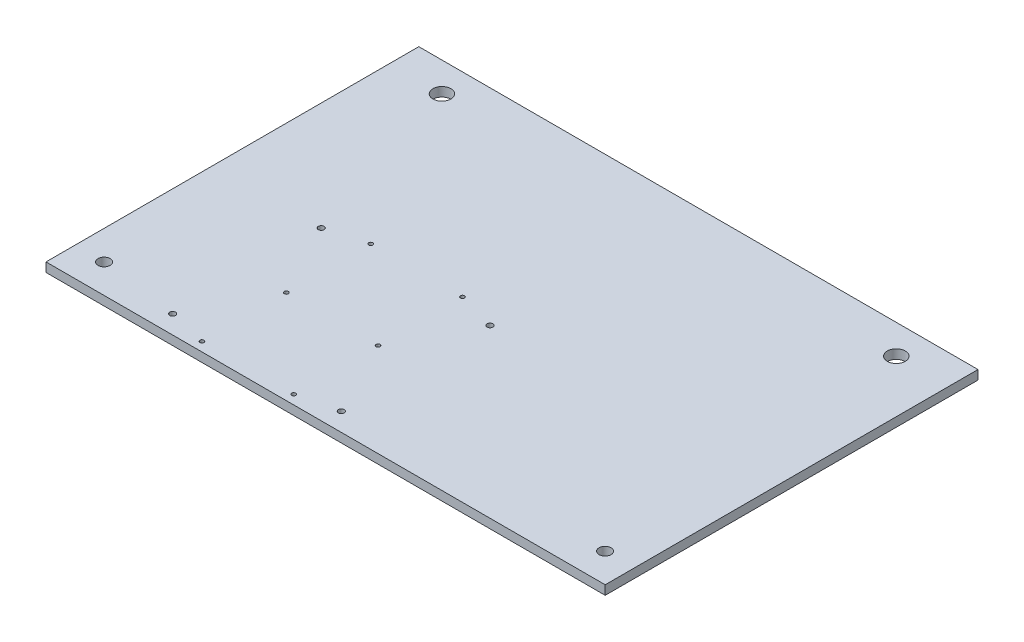
ISO-10303-21;
HEADER;
FILE_DESCRIPTION(('STEP AP214'),'2;1');
FILE_NAME('part.step','',(''),(''),'','','');
FILE_SCHEMA(('AUTOMOTIVE_DESIGN { 1 0 10303 214 1 1 1 1 }'));
ENDSEC;
DATA;
#1=APPLICATION_CONTEXT('core data for automotive mechanical design processes');
#2=APPLICATION_PROTOCOL_DEFINITION('international standard','automotive_design',2000,#1);
#3=PRODUCT_CONTEXT('',#1,'mechanical');
#4=PRODUCT('Part','Part','',(#3));
#5=PRODUCT_RELATED_PRODUCT_CATEGORY('part','',(#4));
#6=PRODUCT_DEFINITION_FORMATION('','',#4);
#7=PRODUCT_DEFINITION_CONTEXT('part definition',#1,'design');
#8=PRODUCT_DEFINITION('design','',#6,#7);
#9=PRODUCT_DEFINITION_SHAPE('','',#8);
#10=(LENGTH_UNIT() NAMED_UNIT(*) SI_UNIT(.MILLI.,.METRE.));
#11=(NAMED_UNIT(*) PLANE_ANGLE_UNIT() SI_UNIT($,.RADIAN.));
#12=(NAMED_UNIT(*) SI_UNIT($,.STERADIAN.) SOLID_ANGLE_UNIT());
#13=UNCERTAINTY_MEASURE_WITH_UNIT(LENGTH_MEASURE(1.E-05),#10,'distance_accuracy_value','');
#14=(GEOMETRIC_REPRESENTATION_CONTEXT(3) GLOBAL_UNCERTAINTY_ASSIGNED_CONTEXT((#13)) GLOBAL_UNIT_ASSIGNED_CONTEXT((#10,
#11,#12)) REPRESENTATION_CONTEXT('',''));
#15=CARTESIAN_POINT('',(0.,0.,0.));
#16=DIRECTION('',(0.,0.,1.));
#17=DIRECTION('',(1.,0.,0.));
#18=AXIS2_PLACEMENT_3D('',#15,#16,#17);
#19=CARTESIAN_POINT('',(0.,5.,0.));
#20=DIRECTION('',(1.,0.,0.));
#21=DIRECTION('',(0.,0.,-1.));
#22=AXIS2_PLACEMENT_3D('',#19,#20,#21);
#23=PLANE('',#22);
#24=DIRECTION('',(0.,0.,1.));
#25=VECTOR('',#24,1.);
#26=CARTESIAN_POINT('',(0.,0.,0.));
#27=LINE('',#26,#25);
#28=CARTESIAN_POINT('',(0.,0.,0.));
#29=VERTEX_POINT('',#28);
#30=CARTESIAN_POINT('',(0.,0.,203.2));
#31=VERTEX_POINT('',#30);
#32=EDGE_CURVE('E98',#29,#31,#27,.T.);
#33=ORIENTED_EDGE('',*,*,#32,.T.);
#34=DIRECTION('',(0.,-1.,0.));
#35=VECTOR('',#34,1.);
#36=CARTESIAN_POINT('',(0.,5.,203.2));
#37=LINE('',#36,#35);
#38=CARTESIAN_POINT('',(0.,5.,203.2));
#39=VERTEX_POINT('',#38);
#40=EDGE_CURVE('E11',#39,#31,#37,.T.);
#41=ORIENTED_EDGE('',*,*,#40,.F.);
#42=DIRECTION('',(0.,0.,1.));
#43=VECTOR('',#42,1.);
#44=CARTESIAN_POINT('',(0.,5.,0.));
#45=LINE('',#44,#43);
#46=CARTESIAN_POINT('',(0.,5.,0.));
#47=VERTEX_POINT('',#46);
#48=EDGE_CURVE('E86',#47,#39,#45,.T.);
#49=ORIENTED_EDGE('',*,*,#48,.F.);
#50=DIRECTION('',(0.,-1.,0.));
#51=VECTOR('',#50,1.);
#52=CARTESIAN_POINT('',(0.,5.,0.));
#53=LINE('',#52,#51);
#54=EDGE_CURVE('E94',#47,#29,#53,.T.);
#55=ORIENTED_EDGE('',*,*,#54,.T.);
#56=EDGE_LOOP('',(#33,#41,#49,#55));
#57=FACE_BOUND('',#56,.T.);
#58=ADVANCED_FACE('F35',(#57),#23,.F.);
#59=CARTESIAN_POINT('',(0.,5.,203.2));
#60=DIRECTION('',(0.,0.,-1.));
#61=DIRECTION('',(-1.,0.,0.));
#62=AXIS2_PLACEMENT_3D('',#59,#60,#61);
#63=PLANE('',#62);
#64=DIRECTION('',(1.,0.,0.));
#65=VECTOR('',#64,1.);
#66=CARTESIAN_POINT('',(0.,0.,203.2));
#67=LINE('',#66,#65);
#68=CARTESIAN_POINT('',(304.8,0.,203.2));
#69=VERTEX_POINT('',#68);
#70=EDGE_CURVE('E90',#31,#69,#67,.T.);
#71=ORIENTED_EDGE('',*,*,#70,.T.);
#72=DIRECTION('',(0.,-1.,0.));
#73=VECTOR('',#72,1.);
#74=CARTESIAN_POINT('',(304.8,5.,203.2));
#75=LINE('',#74,#73);
#76=CARTESIAN_POINT('',(304.8,5.,203.2));
#77=VERTEX_POINT('',#76);
#78=EDGE_CURVE('E43',#77,#69,#75,.T.);
#79=ORIENTED_EDGE('',*,*,#78,.F.);
#80=DIRECTION('',(1.,0.,0.));
#81=VECTOR('',#80,1.);
#82=CARTESIAN_POINT('',(0.,5.,203.2));
#83=LINE('',#82,#81);
#84=EDGE_CURVE('E81',#39,#77,#83,.T.);
#85=ORIENTED_EDGE('',*,*,#84,.F.);
#86=ORIENTED_EDGE('',*,*,#40,.T.);
#87=EDGE_LOOP('',(#71,#79,#85,#86));
#88=FACE_BOUND('',#87,.T.);
#89=ADVANCED_FACE('F89',(#88),#63,.F.);
#90=CARTESIAN_POINT('',(304.8,5.,0.));
#91=DIRECTION('',(-1.,0.,0.));
#92=DIRECTION('',(0.,0.,1.));
#93=AXIS2_PLACEMENT_3D('',#90,#91,#92);
#94=PLANE('',#93);
#95=DIRECTION('',(0.,0.,-1.));
#96=VECTOR('',#95,1.);
#97=CARTESIAN_POINT('',(304.8,0.,0.));
#98=LINE('',#97,#96);
#99=CARTESIAN_POINT('',(304.8,0.,0.));
#100=VERTEX_POINT('',#99);
#101=EDGE_CURVE('E68',#69,#100,#98,.T.);
#102=ORIENTED_EDGE('',*,*,#101,.T.);
#103=DIRECTION('',(0.,-1.,0.));
#104=VECTOR('',#103,1.);
#105=CARTESIAN_POINT('',(304.8,5.,0.));
#106=LINE('',#105,#104);
#107=CARTESIAN_POINT('',(304.8,5.,0.));
#108=VERTEX_POINT('',#107);
#109=EDGE_CURVE('E91',#108,#100,#106,.T.);
#110=ORIENTED_EDGE('',*,*,#109,.F.);
#111=DIRECTION('',(0.,0.,-1.));
#112=VECTOR('',#111,1.);
#113=CARTESIAN_POINT('',(304.8,5.,0.));
#114=LINE('',#113,#112);
#115=EDGE_CURVE('E84',#77,#108,#114,.T.);
#116=ORIENTED_EDGE('',*,*,#115,.F.);
#117=ORIENTED_EDGE('',*,*,#78,.T.);
#118=EDGE_LOOP('',(#102,#110,#116,#117));
#119=FACE_BOUND('',#118,.T.);
#120=ADVANCED_FACE('F92',(#119),#94,.F.);
#121=CARTESIAN_POINT('',(0.,5.,0.));
#122=DIRECTION('',(0.,0.,1.));
#123=DIRECTION('',(1.,0.,0.));
#124=AXIS2_PLACEMENT_3D('',#121,#122,#123);
#125=PLANE('',#124);
#126=DIRECTION('',(-1.,0.,0.));
#127=VECTOR('',#126,1.);
#128=CARTESIAN_POINT('',(0.,0.,0.));
#129=LINE('',#128,#127);
#130=EDGE_CURVE('E74',#100,#29,#129,.T.);
#131=ORIENTED_EDGE('',*,*,#130,.T.);
#132=ORIENTED_EDGE('',*,*,#54,.F.);
#133=DIRECTION('',(-1.,0.,0.));
#134=VECTOR('',#133,1.);
#135=CARTESIAN_POINT('',(0.,5.,0.));
#136=LINE('',#135,#134);
#137=EDGE_CURVE('E51',#108,#47,#136,.T.);
#138=ORIENTED_EDGE('',*,*,#137,.F.);
#139=ORIENTED_EDGE('',*,*,#109,.T.);
#140=EDGE_LOOP('',(#131,#132,#138,#139));
#141=FACE_BOUND('',#140,.T.);
#142=ADVANCED_FACE('F106',(#141),#125,.F.);
#143=CARTESIAN_POINT('',(0.,5.,0.));
#144=DIRECTION('',(0.,1.,0.));
#145=DIRECTION('',(0.,0.,1.));
#146=AXIS2_PLACEMENT_3D('',#143,#144,#145);
#147=PLANE('',#146);
#148=CARTESIAN_POINT('',(28.575,5.,15.9639));
#149=DIRECTION('',(0.,1.,0.));
#150=DIRECTION('',(0.,0.,1.));
#151=AXIS2_PLACEMENT_3D('',#148,#149,#150);
#152=CIRCLE('',#151,4.9022);
#153=CARTESIAN_POINT('',(28.575,5.,20.8661));
#154=VERTEX_POINT('',#153);
#155=EDGE_CURVE('E192',#154,#154,#152,.T.);
#156=ORIENTED_EDGE('',*,*,#155,.F.);
#157=EDGE_LOOP('',(#156));
#158=FACE_BOUND('',#157,.T.);
#159=CARTESIAN_POINT('',(276.225,5.,15.9639));
#160=DIRECTION('',(0.,1.,0.));
#161=DIRECTION('',(0.,0.,1.));
#162=AXIS2_PLACEMENT_3D('',#159,#160,#161);
#163=CIRCLE('',#162,4.90220000000002);
#164=CARTESIAN_POINT('',(276.225,5.,20.8661));
#165=VERTEX_POINT('',#164);
#166=EDGE_CURVE('E186',#165,#165,#163,.T.);
#167=ORIENTED_EDGE('',*,*,#166,.F.);
#168=EDGE_LOOP('',(#167));
#169=FACE_BOUND('',#168,.T.);
#170=CARTESIAN_POINT('',(15.875,5.,187.4139));
#171=DIRECTION('',(0.,1.,0.));
#172=DIRECTION('',(0.,0.,1.));
#173=AXIS2_PLACEMENT_3D('',#170,#171,#172);
#174=CIRCLE('',#173,3.2639);
#175=CARTESIAN_POINT('',(15.875,5.,190.6778));
#176=VERTEX_POINT('',#175);
#177=EDGE_CURVE('E180',#176,#176,#174,.T.);
#178=ORIENTED_EDGE('',*,*,#177,.F.);
#179=EDGE_LOOP('',(#178));
#180=FACE_BOUND('',#179,.T.);
#181=CARTESIAN_POINT('',(288.925,5.,187.4139));
#182=DIRECTION('',(0.,1.,0.));
#183=DIRECTION('',(0.,0.,1.));
#184=AXIS2_PLACEMENT_3D('',#181,#182,#183);
#185=CIRCLE('',#184,3.26389999999999);
#186=CARTESIAN_POINT('',(288.925,5.,190.6778));
#187=VERTEX_POINT('',#186);
#188=EDGE_CURVE('E174',#187,#187,#185,.T.);
#189=ORIENTED_EDGE('',*,*,#188,.F.);
#190=EDGE_LOOP('',(#189));
#191=FACE_BOUND('',#190,.T.);
#192=CARTESIAN_POINT('',(59.,5.,112.2));
#193=DIRECTION('',(0.,1.,0.));
#194=DIRECTION('',(0.,0.,1.));
#195=AXIS2_PLACEMENT_3D('',#192,#193,#194);
#196=CIRCLE('',#195,1.59999999999999);
#197=CARTESIAN_POINT('',(59.,5.,113.8));
#198=VERTEX_POINT('',#197);
#199=EDGE_CURVE('E168',#198,#198,#196,.T.);
#200=ORIENTED_EDGE('',*,*,#199,.F.);
#201=EDGE_LOOP('',(#200));
#202=FACE_BOUND('',#201,.T.);
#203=CARTESIAN_POINT('',(151.,5.,112.2));
#204=DIRECTION('',(0.,1.,0.));
#205=DIRECTION('',(0.,0.,1.));
#206=AXIS2_PLACEMENT_3D('',#203,#204,#205);
#207=CIRCLE('',#206,1.59999999999999);
#208=CARTESIAN_POINT('',(151.,5.,113.8));
#209=VERTEX_POINT('',#208);
#210=EDGE_CURVE('E162',#209,#209,#207,.T.);
#211=ORIENTED_EDGE('',*,*,#210,.F.);
#212=EDGE_LOOP('',(#211));
#213=FACE_BOUND('',#212,.T.);
#214=CARTESIAN_POINT('',(151.,5.,193.2));
#215=DIRECTION('',(0.,1.,0.));
#216=DIRECTION('',(0.,0.,1.));
#217=AXIS2_PLACEMENT_3D('',#214,#215,#216);
#218=CIRCLE('',#217,1.59999999999999);
#219=CARTESIAN_POINT('',(151.,5.,194.8));
#220=VERTEX_POINT('',#219);
#221=EDGE_CURVE('E156',#220,#220,#218,.T.);
#222=ORIENTED_EDGE('',*,*,#221,.F.);
#223=EDGE_LOOP('',(#222));
#224=FACE_BOUND('',#223,.T.);
#225=CARTESIAN_POINT('',(59.,5.,193.2));
#226=DIRECTION('',(0.,1.,0.));
#227=DIRECTION('',(0.,0.,1.));
#228=AXIS2_PLACEMENT_3D('',#225,#226,#227);
#229=CIRCLE('',#228,1.59999999999999);
#230=CARTESIAN_POINT('',(59.,5.,194.8));
#231=VERTEX_POINT('',#230);
#232=EDGE_CURVE('E150',#231,#231,#229,.T.);
#233=ORIENTED_EDGE('',*,*,#232,.F.);
#234=EDGE_LOOP('',(#233));
#235=FACE_BOUND('',#234,.T.);
#236=CARTESIAN_POINT('',(80.,5.,106.2));
#237=DIRECTION('',(0.,1.,0.));
#238=DIRECTION('',(0.,0.,1.));
#239=AXIS2_PLACEMENT_3D('',#236,#237,#238);
#240=CIRCLE('',#239,1.1);
#241=CARTESIAN_POINT('',(80.,5.,107.3));
#242=VERTEX_POINT('',#241);
#243=EDGE_CURVE('E144',#242,#242,#240,.T.);
#244=ORIENTED_EDGE('',*,*,#243,.F.);
#245=EDGE_LOOP('',(#244));
#246=FACE_BOUND('',#245,.T.);
#247=CARTESIAN_POINT('',(130.,5.,106.2));
#248=DIRECTION('',(0.,1.,0.));
#249=DIRECTION('',(0.,0.,1.));
#250=AXIS2_PLACEMENT_3D('',#247,#248,#249);
#251=CIRCLE('',#250,1.09999999999999);
#252=CARTESIAN_POINT('',(130.,5.,107.3));
#253=VERTEX_POINT('',#252);
#254=EDGE_CURVE('E138',#253,#253,#251,.T.);
#255=ORIENTED_EDGE('',*,*,#254,.F.);
#256=EDGE_LOOP('',(#255));
#257=FACE_BOUND('',#256,.T.);
#258=CARTESIAN_POINT('',(130.,5.,152.2));
#259=DIRECTION('',(0.,1.,0.));
#260=DIRECTION('',(0.,0.,1.));
#261=AXIS2_PLACEMENT_3D('',#258,#259,#260);
#262=CIRCLE('',#261,1.09999999999999);
#263=CARTESIAN_POINT('',(130.,5.,153.3));
#264=VERTEX_POINT('',#263);
#265=EDGE_CURVE('E132',#264,#264,#262,.T.);
#266=ORIENTED_EDGE('',*,*,#265,.F.);
#267=EDGE_LOOP('',(#266));
#268=FACE_BOUND('',#267,.T.);
#269=CARTESIAN_POINT('',(80.,5.,152.2));
#270=DIRECTION('',(0.,1.,0.));
#271=DIRECTION('',(0.,0.,1.));
#272=AXIS2_PLACEMENT_3D('',#269,#270,#271);
#273=CIRCLE('',#272,1.1);
#274=CARTESIAN_POINT('',(80.,5.,153.3));
#275=VERTEX_POINT('',#274);
#276=EDGE_CURVE('E126',#275,#275,#273,.T.);
#277=ORIENTED_EDGE('',*,*,#276,.F.);
#278=EDGE_LOOP('',(#277));
#279=FACE_BOUND('',#278,.T.);
#280=CARTESIAN_POINT('',(80.,5.,198.2));
#281=DIRECTION('',(0.,1.,0.));
#282=DIRECTION('',(0.,0.,1.));
#283=AXIS2_PLACEMENT_3D('',#280,#281,#282);
#284=CIRCLE('',#283,1.1);
#285=CARTESIAN_POINT('',(80.,5.,199.3));
#286=VERTEX_POINT('',#285);
#287=EDGE_CURVE('E120',#286,#286,#284,.T.);
#288=ORIENTED_EDGE('',*,*,#287,.F.);
#289=EDGE_LOOP('',(#288));
#290=FACE_BOUND('',#289,.T.);
#291=CARTESIAN_POINT('',(130.,5.,198.2));
#292=DIRECTION('',(0.,1.,0.));
#293=DIRECTION('',(0.,0.,1.));
#294=AXIS2_PLACEMENT_3D('',#291,#292,#293);
#295=CIRCLE('',#294,1.09999999999999);
#296=CARTESIAN_POINT('',(130.,5.,199.3));
#297=VERTEX_POINT('',#296);
#298=EDGE_CURVE('E114',#297,#297,#295,.T.);
#299=ORIENTED_EDGE('',*,*,#298,.F.);
#300=EDGE_LOOP('',(#299));
#301=FACE_BOUND('',#300,.T.);
#302=ORIENTED_EDGE('',*,*,#48,.T.);
#303=ORIENTED_EDGE('',*,*,#84,.T.);
#304=ORIENTED_EDGE('',*,*,#115,.T.);
#305=ORIENTED_EDGE('',*,*,#137,.T.);
#306=EDGE_LOOP('',(#302,#303,#304,#305));
#307=FACE_BOUND('',#306,.T.);
#308=ADVANCED_FACE('F82',(#158,#169,#180,#191,#202,#213,#224,#235,#246,#257,#268,#279,#290,#301,
#307),#147,.T.);
#309=CARTESIAN_POINT('',(0.,0.,0.));
#310=DIRECTION('',(0.,1.,0.));
#311=DIRECTION('',(0.,0.,1.));
#312=AXIS2_PLACEMENT_3D('',#309,#310,#311);
#313=PLANE('',#312);
#314=CARTESIAN_POINT('',(28.575,0.,15.9639));
#315=DIRECTION('',(0.,1.,0.));
#316=DIRECTION('',(0.,0.,1.));
#317=AXIS2_PLACEMENT_3D('',#314,#315,#316);
#318=CIRCLE('',#317,4.9022);
#319=CARTESIAN_POINT('',(28.575,0.,20.8661));
#320=VERTEX_POINT('',#319);
#321=EDGE_CURVE('E189',#320,#320,#318,.T.);
#322=ORIENTED_EDGE('',*,*,#321,.T.);
#323=EDGE_LOOP('',(#322));
#324=FACE_BOUND('',#323,.T.);
#325=CARTESIAN_POINT('',(276.225,0.,15.9639));
#326=DIRECTION('',(0.,1.,0.));
#327=DIRECTION('',(0.,0.,1.));
#328=AXIS2_PLACEMENT_3D('',#325,#326,#327);
#329=CIRCLE('',#328,4.90220000000002);
#330=CARTESIAN_POINT('',(276.225,0.,20.8661));
#331=VERTEX_POINT('',#330);
#332=EDGE_CURVE('E183',#331,#331,#329,.T.);
#333=ORIENTED_EDGE('',*,*,#332,.T.);
#334=EDGE_LOOP('',(#333));
#335=FACE_BOUND('',#334,.T.);
#336=CARTESIAN_POINT('',(15.875,0.,187.4139));
#337=DIRECTION('',(0.,1.,0.));
#338=DIRECTION('',(0.,0.,1.));
#339=AXIS2_PLACEMENT_3D('',#336,#337,#338);
#340=CIRCLE('',#339,3.2639);
#341=CARTESIAN_POINT('',(15.875,0.,190.6778));
#342=VERTEX_POINT('',#341);
#343=EDGE_CURVE('E177',#342,#342,#340,.T.);
#344=ORIENTED_EDGE('',*,*,#343,.T.);
#345=EDGE_LOOP('',(#344));
#346=FACE_BOUND('',#345,.T.);
#347=CARTESIAN_POINT('',(288.925,0.,187.4139));
#348=DIRECTION('',(0.,1.,0.));
#349=DIRECTION('',(0.,0.,1.));
#350=AXIS2_PLACEMENT_3D('',#347,#348,#349);
#351=CIRCLE('',#350,3.26389999999999);
#352=CARTESIAN_POINT('',(288.925,0.,190.6778));
#353=VERTEX_POINT('',#352);
#354=EDGE_CURVE('E171',#353,#353,#351,.T.);
#355=ORIENTED_EDGE('',*,*,#354,.T.);
#356=EDGE_LOOP('',(#355));
#357=FACE_BOUND('',#356,.T.);
#358=CARTESIAN_POINT('',(59.,0.,112.2));
#359=DIRECTION('',(0.,1.,0.));
#360=DIRECTION('',(0.,0.,1.));
#361=AXIS2_PLACEMENT_3D('',#358,#359,#360);
#362=CIRCLE('',#361,1.59999999999999);
#363=CARTESIAN_POINT('',(59.,0.,113.8));
#364=VERTEX_POINT('',#363);
#365=EDGE_CURVE('E165',#364,#364,#362,.T.);
#366=ORIENTED_EDGE('',*,*,#365,.T.);
#367=EDGE_LOOP('',(#366));
#368=FACE_BOUND('',#367,.T.);
#369=CARTESIAN_POINT('',(151.,0.,112.2));
#370=DIRECTION('',(0.,1.,0.));
#371=DIRECTION('',(0.,0.,1.));
#372=AXIS2_PLACEMENT_3D('',#369,#370,#371);
#373=CIRCLE('',#372,1.59999999999999);
#374=CARTESIAN_POINT('',(151.,0.,113.8));
#375=VERTEX_POINT('',#374);
#376=EDGE_CURVE('E159',#375,#375,#373,.T.);
#377=ORIENTED_EDGE('',*,*,#376,.T.);
#378=EDGE_LOOP('',(#377));
#379=FACE_BOUND('',#378,.T.);
#380=CARTESIAN_POINT('',(151.,0.,193.2));
#381=DIRECTION('',(0.,1.,0.));
#382=DIRECTION('',(0.,0.,1.));
#383=AXIS2_PLACEMENT_3D('',#380,#381,#382);
#384=CIRCLE('',#383,1.59999999999999);
#385=CARTESIAN_POINT('',(151.,0.,194.8));
#386=VERTEX_POINT('',#385);
#387=EDGE_CURVE('E153',#386,#386,#384,.T.);
#388=ORIENTED_EDGE('',*,*,#387,.T.);
#389=EDGE_LOOP('',(#388));
#390=FACE_BOUND('',#389,.T.);
#391=CARTESIAN_POINT('',(59.,0.,193.2));
#392=DIRECTION('',(0.,1.,0.));
#393=DIRECTION('',(0.,0.,1.));
#394=AXIS2_PLACEMENT_3D('',#391,#392,#393);
#395=CIRCLE('',#394,1.59999999999999);
#396=CARTESIAN_POINT('',(59.,0.,194.8));
#397=VERTEX_POINT('',#396);
#398=EDGE_CURVE('E147',#397,#397,#395,.T.);
#399=ORIENTED_EDGE('',*,*,#398,.T.);
#400=EDGE_LOOP('',(#399));
#401=FACE_BOUND('',#400,.T.);
#402=CARTESIAN_POINT('',(80.,0.,106.2));
#403=DIRECTION('',(0.,1.,0.));
#404=DIRECTION('',(0.,0.,1.));
#405=AXIS2_PLACEMENT_3D('',#402,#403,#404);
#406=CIRCLE('',#405,1.1);
#407=CARTESIAN_POINT('',(80.,0.,107.3));
#408=VERTEX_POINT('',#407);
#409=EDGE_CURVE('E141',#408,#408,#406,.T.);
#410=ORIENTED_EDGE('',*,*,#409,.T.);
#411=EDGE_LOOP('',(#410));
#412=FACE_BOUND('',#411,.T.);
#413=CARTESIAN_POINT('',(130.,0.,106.2));
#414=DIRECTION('',(0.,1.,0.));
#415=DIRECTION('',(0.,0.,1.));
#416=AXIS2_PLACEMENT_3D('',#413,#414,#415);
#417=CIRCLE('',#416,1.09999999999999);
#418=CARTESIAN_POINT('',(130.,0.,107.3));
#419=VERTEX_POINT('',#418);
#420=EDGE_CURVE('E135',#419,#419,#417,.T.);
#421=ORIENTED_EDGE('',*,*,#420,.T.);
#422=EDGE_LOOP('',(#421));
#423=FACE_BOUND('',#422,.T.);
#424=CARTESIAN_POINT('',(130.,0.,152.2));
#425=DIRECTION('',(0.,1.,0.));
#426=DIRECTION('',(0.,0.,1.));
#427=AXIS2_PLACEMENT_3D('',#424,#425,#426);
#428=CIRCLE('',#427,1.09999999999999);
#429=CARTESIAN_POINT('',(130.,0.,153.3));
#430=VERTEX_POINT('',#429);
#431=EDGE_CURVE('E129',#430,#430,#428,.T.);
#432=ORIENTED_EDGE('',*,*,#431,.T.);
#433=EDGE_LOOP('',(#432));
#434=FACE_BOUND('',#433,.T.);
#435=CARTESIAN_POINT('',(80.,0.,152.2));
#436=DIRECTION('',(0.,1.,0.));
#437=DIRECTION('',(0.,0.,1.));
#438=AXIS2_PLACEMENT_3D('',#435,#436,#437);
#439=CIRCLE('',#438,1.1);
#440=CARTESIAN_POINT('',(80.,0.,153.3));
#441=VERTEX_POINT('',#440);
#442=EDGE_CURVE('E123',#441,#441,#439,.T.);
#443=ORIENTED_EDGE('',*,*,#442,.T.);
#444=EDGE_LOOP('',(#443));
#445=FACE_BOUND('',#444,.T.);
#446=CARTESIAN_POINT('',(80.,0.,198.2));
#447=DIRECTION('',(0.,1.,0.));
#448=DIRECTION('',(0.,0.,1.));
#449=AXIS2_PLACEMENT_3D('',#446,#447,#448);
#450=CIRCLE('',#449,1.1);
#451=CARTESIAN_POINT('',(80.,0.,199.3));
#452=VERTEX_POINT('',#451);
#453=EDGE_CURVE('E117',#452,#452,#450,.T.);
#454=ORIENTED_EDGE('',*,*,#453,.T.);
#455=EDGE_LOOP('',(#454));
#456=FACE_BOUND('',#455,.T.);
#457=CARTESIAN_POINT('',(130.,0.,198.2));
#458=DIRECTION('',(0.,1.,0.));
#459=DIRECTION('',(0.,0.,1.));
#460=AXIS2_PLACEMENT_3D('',#457,#458,#459);
#461=CIRCLE('',#460,1.09999999999999);
#462=CARTESIAN_POINT('',(130.,0.,199.3));
#463=VERTEX_POINT('',#462);
#464=EDGE_CURVE('E101',#463,#463,#461,.T.);
#465=ORIENTED_EDGE('',*,*,#464,.T.);
#466=EDGE_LOOP('',(#465));
#467=FACE_BOUND('',#466,.T.);
#468=ORIENTED_EDGE('',*,*,#32,.F.);
#469=ORIENTED_EDGE('',*,*,#130,.F.);
#470=ORIENTED_EDGE('',*,*,#101,.F.);
#471=ORIENTED_EDGE('',*,*,#70,.F.);
#472=EDGE_LOOP('',(#468,#469,#470,#471));
#473=FACE_BOUND('',#472,.T.);
#474=ADVANCED_FACE('F109',(#324,#335,#346,#357,#368,#379,#390,#401,#412,#423,#434,#445,#456,
#467,#473),#313,.F.);
#475=CARTESIAN_POINT('',(130.,5.,198.2));
#476=DIRECTION('',(0.,1.,0.));
#477=DIRECTION('',(0.,0.,1.));
#478=AXIS2_PLACEMENT_3D('',#475,#476,#477);
#479=CYLINDRICAL_SURFACE('',#478,1.09999999999999);
#480=ORIENTED_EDGE('',*,*,#464,.F.);
#481=EDGE_LOOP('',(#480));
#482=FACE_BOUND('',#481,.T.);
#483=ORIENTED_EDGE('',*,*,#298,.T.);
#484=EDGE_LOOP('',(#483));
#485=FACE_BOUND('',#484,.T.);
#486=ADVANCED_FACE('F227',(#482,#485),#479,.F.);
#487=CARTESIAN_POINT('',(80.,5.,198.2));
#488=DIRECTION('',(0.,1.,0.));
#489=DIRECTION('',(0.,0.,1.));
#490=AXIS2_PLACEMENT_3D('',#487,#488,#489);
#491=CYLINDRICAL_SURFACE('',#490,1.1);
#492=ORIENTED_EDGE('',*,*,#453,.F.);
#493=EDGE_LOOP('',(#492));
#494=FACE_BOUND('',#493,.T.);
#495=ORIENTED_EDGE('',*,*,#287,.T.);
#496=EDGE_LOOP('',(#495));
#497=FACE_BOUND('',#496,.T.);
#498=ADVANCED_FACE('F229',(#494,#497),#491,.F.);
#499=CARTESIAN_POINT('',(80.,5.,152.2));
#500=DIRECTION('',(0.,1.,0.));
#501=DIRECTION('',(0.,0.,1.));
#502=AXIS2_PLACEMENT_3D('',#499,#500,#501);
#503=CYLINDRICAL_SURFACE('',#502,1.1);
#504=ORIENTED_EDGE('',*,*,#442,.F.);
#505=EDGE_LOOP('',(#504));
#506=FACE_BOUND('',#505,.T.);
#507=ORIENTED_EDGE('',*,*,#276,.T.);
#508=EDGE_LOOP('',(#507));
#509=FACE_BOUND('',#508,.T.);
#510=ADVANCED_FACE('F236',(#506,#509),#503,.F.);
#511=CARTESIAN_POINT('',(130.,5.,152.2));
#512=DIRECTION('',(0.,1.,0.));
#513=DIRECTION('',(0.,0.,1.));
#514=AXIS2_PLACEMENT_3D('',#511,#512,#513);
#515=CYLINDRICAL_SURFACE('',#514,1.09999999999999);
#516=ORIENTED_EDGE('',*,*,#431,.F.);
#517=EDGE_LOOP('',(#516));
#518=FACE_BOUND('',#517,.T.);
#519=ORIENTED_EDGE('',*,*,#265,.T.);
#520=EDGE_LOOP('',(#519));
#521=FACE_BOUND('',#520,.T.);
#522=ADVANCED_FACE('F323',(#518,#521),#515,.F.);
#523=CARTESIAN_POINT('',(130.,5.,106.2));
#524=DIRECTION('',(0.,1.,0.));
#525=DIRECTION('',(0.,0.,1.));
#526=AXIS2_PLACEMENT_3D('',#523,#524,#525);
#527=CYLINDRICAL_SURFACE('',#526,1.09999999999999);
#528=ORIENTED_EDGE('',*,*,#420,.F.);
#529=EDGE_LOOP('',(#528));
#530=FACE_BOUND('',#529,.T.);
#531=ORIENTED_EDGE('',*,*,#254,.T.);
#532=EDGE_LOOP('',(#531));
#533=FACE_BOUND('',#532,.T.);
#534=ADVANCED_FACE('F319',(#530,#533),#527,.F.);
#535=CARTESIAN_POINT('',(80.,5.,106.2));
#536=DIRECTION('',(0.,1.,0.));
#537=DIRECTION('',(0.,0.,1.));
#538=AXIS2_PLACEMENT_3D('',#535,#536,#537);
#539=CYLINDRICAL_SURFACE('',#538,1.1);
#540=ORIENTED_EDGE('',*,*,#409,.F.);
#541=EDGE_LOOP('',(#540));
#542=FACE_BOUND('',#541,.T.);
#543=ORIENTED_EDGE('',*,*,#243,.T.);
#544=EDGE_LOOP('',(#543));
#545=FACE_BOUND('',#544,.T.);
#546=ADVANCED_FACE('F315',(#542,#545),#539,.F.);
#547=CARTESIAN_POINT('',(59.,5.,193.2));
#548=DIRECTION('',(0.,1.,0.));
#549=DIRECTION('',(0.,0.,1.));
#550=AXIS2_PLACEMENT_3D('',#547,#548,#549);
#551=CYLINDRICAL_SURFACE('',#550,1.59999999999999);
#552=ORIENTED_EDGE('',*,*,#398,.F.);
#553=EDGE_LOOP('',(#552));
#554=FACE_BOUND('',#553,.T.);
#555=ORIENTED_EDGE('',*,*,#232,.T.);
#556=EDGE_LOOP('',(#555));
#557=FACE_BOUND('',#556,.T.);
#558=ADVANCED_FACE('F311',(#554,#557),#551,.F.);
#559=CARTESIAN_POINT('',(151.,5.,193.2));
#560=DIRECTION('',(0.,1.,0.));
#561=DIRECTION('',(0.,0.,1.));
#562=AXIS2_PLACEMENT_3D('',#559,#560,#561);
#563=CYLINDRICAL_SURFACE('',#562,1.59999999999999);
#564=ORIENTED_EDGE('',*,*,#387,.F.);
#565=EDGE_LOOP('',(#564));
#566=FACE_BOUND('',#565,.T.);
#567=ORIENTED_EDGE('',*,*,#221,.T.);
#568=EDGE_LOOP('',(#567));
#569=FACE_BOUND('',#568,.T.);
#570=ADVANCED_FACE('F307',(#566,#569),#563,.F.);
#571=CARTESIAN_POINT('',(151.,5.,112.2));
#572=DIRECTION('',(0.,1.,0.));
#573=DIRECTION('',(0.,0.,1.));
#574=AXIS2_PLACEMENT_3D('',#571,#572,#573);
#575=CYLINDRICAL_SURFACE('',#574,1.59999999999999);
#576=ORIENTED_EDGE('',*,*,#376,.F.);
#577=EDGE_LOOP('',(#576));
#578=FACE_BOUND('',#577,.T.);
#579=ORIENTED_EDGE('',*,*,#210,.T.);
#580=EDGE_LOOP('',(#579));
#581=FACE_BOUND('',#580,.T.);
#582=ADVANCED_FACE('F303',(#578,#581),#575,.F.);
#583=CARTESIAN_POINT('',(59.,5.,112.2));
#584=DIRECTION('',(0.,1.,0.));
#585=DIRECTION('',(0.,0.,1.));
#586=AXIS2_PLACEMENT_3D('',#583,#584,#585);
#587=CYLINDRICAL_SURFACE('',#586,1.59999999999999);
#588=ORIENTED_EDGE('',*,*,#365,.F.);
#589=EDGE_LOOP('',(#588));
#590=FACE_BOUND('',#589,.T.);
#591=ORIENTED_EDGE('',*,*,#199,.T.);
#592=EDGE_LOOP('',(#591));
#593=FACE_BOUND('',#592,.T.);
#594=ADVANCED_FACE('F299',(#590,#593),#587,.F.);
#595=CARTESIAN_POINT('',(288.925,5.,187.4139));
#596=DIRECTION('',(0.,1.,0.));
#597=DIRECTION('',(0.,0.,1.));
#598=AXIS2_PLACEMENT_3D('',#595,#596,#597);
#599=CYLINDRICAL_SURFACE('',#598,3.26389999999999);
#600=ORIENTED_EDGE('',*,*,#354,.F.);
#601=EDGE_LOOP('',(#600));
#602=FACE_BOUND('',#601,.T.);
#603=ORIENTED_EDGE('',*,*,#188,.T.);
#604=EDGE_LOOP('',(#603));
#605=FACE_BOUND('',#604,.T.);
#606=ADVANCED_FACE('F295',(#602,#605),#599,.F.);
#607=CARTESIAN_POINT('',(15.875,5.,187.4139));
#608=DIRECTION('',(0.,1.,0.));
#609=DIRECTION('',(0.,0.,1.));
#610=AXIS2_PLACEMENT_3D('',#607,#608,#609);
#611=CYLINDRICAL_SURFACE('',#610,3.2639);
#612=ORIENTED_EDGE('',*,*,#343,.F.);
#613=EDGE_LOOP('',(#612));
#614=FACE_BOUND('',#613,.T.);
#615=ORIENTED_EDGE('',*,*,#177,.T.);
#616=EDGE_LOOP('',(#615));
#617=FACE_BOUND('',#616,.T.);
#618=ADVANCED_FACE('F276',(#614,#617),#611,.F.);
#619=CARTESIAN_POINT('',(276.225,5.,15.9639));
#620=DIRECTION('',(0.,1.,0.));
#621=DIRECTION('',(0.,0.,1.));
#622=AXIS2_PLACEMENT_3D('',#619,#620,#621);
#623=CYLINDRICAL_SURFACE('',#622,4.90220000000002);
#624=ORIENTED_EDGE('',*,*,#332,.F.);
#625=EDGE_LOOP('',(#624));
#626=FACE_BOUND('',#625,.T.);
#627=ORIENTED_EDGE('',*,*,#166,.T.);
#628=EDGE_LOOP('',(#627));
#629=FACE_BOUND('',#628,.T.);
#630=ADVANCED_FACE('F271',(#626,#629),#623,.F.);
#631=CARTESIAN_POINT('',(28.575,5.,15.9639));
#632=DIRECTION('',(0.,1.,0.));
#633=DIRECTION('',(0.,0.,1.));
#634=AXIS2_PLACEMENT_3D('',#631,#632,#633);
#635=CYLINDRICAL_SURFACE('',#634,4.9022);
#636=ORIENTED_EDGE('',*,*,#321,.F.);
#637=EDGE_LOOP('',(#636));
#638=FACE_BOUND('',#637,.T.);
#639=ORIENTED_EDGE('',*,*,#155,.T.);
#640=EDGE_LOOP('',(#639));
#641=FACE_BOUND('',#640,.T.);
#642=ADVANCED_FACE('F196',(#638,#641),#635,.F.);
#643=CLOSED_SHELL('',(#58,#89,#120,#142,#308,#474,#486,#498,#510,#522,#534,#546,#558,#570,#582,
#594,#606,#618,#630,#642));
#644=MANIFOLD_SOLID_BREP('B2',#643);
#645=ADVANCED_BREP_SHAPE_REPRESENTATION('',(#18,#644),#14);
#646=SHAPE_DEFINITION_REPRESENTATION(#9,#645);
ENDSEC;
END-ISO-10303-21;
